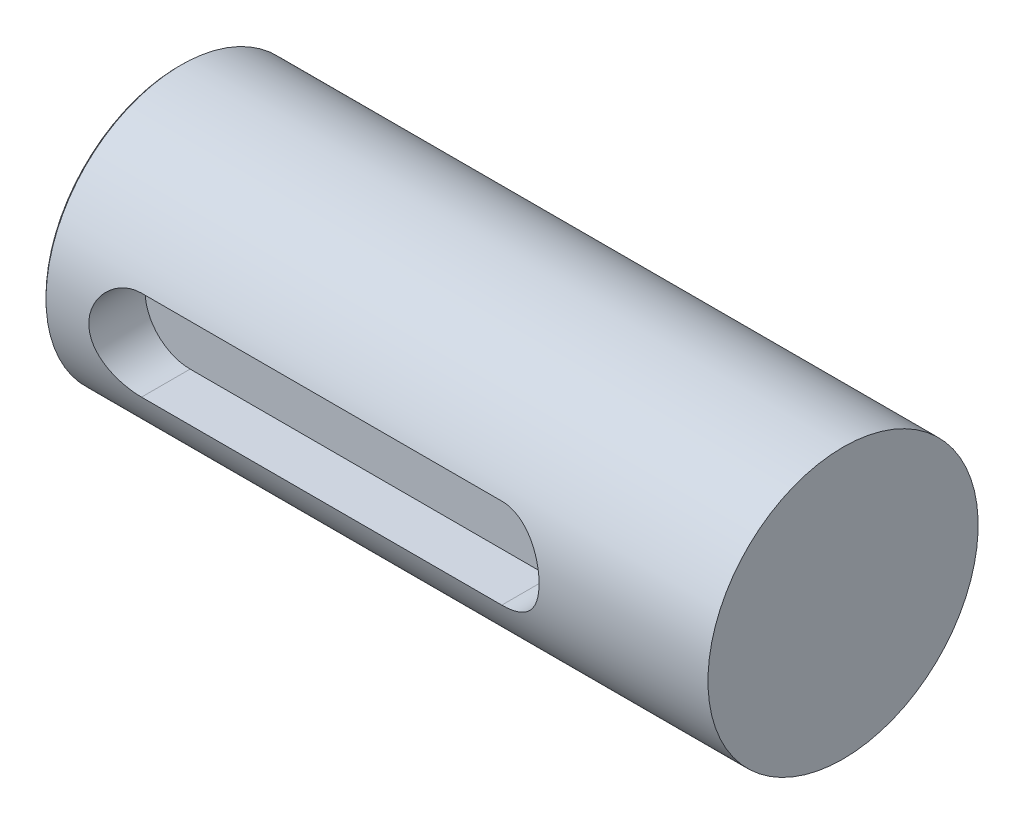
ISO-10303-21;
HEADER;
FILE_DESCRIPTION(('STEP AP214'),'2;1');
FILE_NAME('part.step','',(''),(''),'','','');
FILE_SCHEMA(('AUTOMOTIVE_DESIGN { 1 0 10303 214 1 1 1 1 }'));
ENDSEC;
DATA;
#1=APPLICATION_CONTEXT('core data for automotive mechanical design processes');
#2=APPLICATION_PROTOCOL_DEFINITION('international standard','automotive_design',2000,#1);
#3=PRODUCT_CONTEXT('',#1,'mechanical');
#4=PRODUCT('Part','Part','',(#3));
#5=PRODUCT_RELATED_PRODUCT_CATEGORY('part','',(#4));
#6=PRODUCT_DEFINITION_FORMATION('','',#4);
#7=PRODUCT_DEFINITION_CONTEXT('part definition',#1,'design');
#8=PRODUCT_DEFINITION('design','',#6,#7);
#9=PRODUCT_DEFINITION_SHAPE('','',#8);
#10=(LENGTH_UNIT() NAMED_UNIT(*) SI_UNIT(.MILLI.,.METRE.));
#11=(NAMED_UNIT(*) PLANE_ANGLE_UNIT() SI_UNIT($,.RADIAN.));
#12=(NAMED_UNIT(*) SI_UNIT($,.STERADIAN.) SOLID_ANGLE_UNIT());
#13=UNCERTAINTY_MEASURE_WITH_UNIT(LENGTH_MEASURE(1.E-05),#10,'distance_accuracy_value','');
#14=(GEOMETRIC_REPRESENTATION_CONTEXT(3) GLOBAL_UNCERTAINTY_ASSIGNED_CONTEXT((#13)) GLOBAL_UNIT_ASSIGNED_CONTEXT((#10,
#11,#12)) REPRESENTATION_CONTEXT('',''));
#15=CARTESIAN_POINT('',(0.,0.,0.));
#16=DIRECTION('',(0.,0.,1.));
#17=DIRECTION('',(1.,0.,0.));
#18=AXIS2_PLACEMENT_3D('',#15,#16,#17);
#19=CARTESIAN_POINT('',(-9.5,-2.,3.5));
#20=DIRECTION('',(0.,-1.,0.));
#21=DIRECTION('',(0.,0.,-1.));
#22=AXIS2_PLACEMENT_3D('',#19,#20,#21);
#23=PLANE('',#22);
#24=DIRECTION('',(-1.,0.,0.));
#25=VECTOR('',#24,1.);
#26=CARTESIAN_POINT('',(-9.5,-2.,5.656854249492));
#27=LINE('',#26,#25);
#28=CARTESIAN_POINT('',(-9.5,-2.,5.656854249492));
#29=VERTEX_POINT('',#28);
#30=CARTESIAN_POINT('',(-25.5,-2.,5.656854249492));
#31=VERTEX_POINT('',#30);
#32=EDGE_CURVE('E88',#29,#31,#27,.T.);
#33=ORIENTED_EDGE('',*,*,#32,.F.);
#34=DIRECTION('',(0.,0.,1.));
#35=VECTOR('',#34,1.);
#36=CARTESIAN_POINT('',(-9.5,-2.,3.5));
#37=LINE('',#36,#35);
#38=CARTESIAN_POINT('',(-9.5,-2.,3.5));
#39=VERTEX_POINT('',#38);
#40=EDGE_CURVE('E11',#39,#29,#37,.T.);
#41=ORIENTED_EDGE('',*,*,#40,.F.);
#42=DIRECTION('',(-1.,0.,0.));
#43=VECTOR('',#42,1.);
#44=CARTESIAN_POINT('',(-9.5,-2.,3.5));
#45=LINE('',#44,#43);
#46=CARTESIAN_POINT('',(-25.5,-2.,3.5));
#47=VERTEX_POINT('',#46);
#48=EDGE_CURVE('E86',#39,#47,#45,.T.);
#49=ORIENTED_EDGE('',*,*,#48,.T.);
#50=DIRECTION('',(0.,0.,-1.));
#51=VECTOR('',#50,1.);
#52=CARTESIAN_POINT('',(-25.5,-2.,5.656854249492));
#53=LINE('',#52,#51);
#54=EDGE_CURVE('E178',#31,#47,#53,.T.);
#55=ORIENTED_EDGE('',*,*,#54,.F.);
#56=EDGE_LOOP('',(#33,#41,#49,#55));
#57=FACE_BOUND('',#56,.T.);
#58=ADVANCED_FACE('F17',(#57),#23,.F.);
#59=CARTESIAN_POINT('',(-9.5,0.,3.5));
#60=DIRECTION('',(0.,0.,-1.));
#61=DIRECTION('',(0.,-1.,0.));
#62=AXIS2_PLACEMENT_3D('',#59,#60,#61);
#63=CYLINDRICAL_SURFACE('',#62,2.);
#64=CARTESIAN_POINT('',(-9.50000000000001,-2.,5.65685424949238));
#65=CARTESIAN_POINT('',(-9.46888727933629,-2.00000085053112,5.65685451528089));
#66=CARTESIAN_POINT('',(-9.43777507841208,-1.99927403942647,5.65712883653932));
#67=CARTESIAN_POINT('',(-9.37512510014198,-1.99634779946615,5.65820957137652));
#68=CARTESIAN_POINT('',(-9.34358856935879,-1.99412476525183,5.65902451108427));
#69=CARTESIAN_POINT('',(-9.28016475893564,-1.98814075978606,5.66118632629942));
#70=CARTESIAN_POINT('',(-9.24828006013282,-1.98435548684095,5.66254159512988));
#71=CARTESIAN_POINT('',(-9.18424071907965,-1.97518585038153,5.66578415810092));
#72=CARTESIAN_POINT('',(-9.15209005890953,-1.96977659951175,5.66767970727348));
#73=CARTESIAN_POINT('',(-9.08760628317206,-1.95730101960362,5.67200342892186));
#74=CARTESIAN_POINT('',(-9.05527862417273,-1.95020930914261,5.67443971854995));
#75=CARTESIAN_POINT('',(-8.9905343523952,-1.93431478105617,5.67984323146518));
#76=CARTESIAN_POINT('',(-8.95812472799632,-1.9254861892777,5.68281839067245));
#77=CARTESIAN_POINT('',(-8.89331797891303,-1.90606916610999,5.68930683701968));
#78=CARTESIAN_POINT('',(-8.86092945830196,-1.895454687067,5.6928280176363));
#79=CARTESIAN_POINT('',(-8.79626674788044,-1.87241981442431,5.70038173738445));
#80=CARTESIAN_POINT('',(-8.76400273497141,-1.85997317208112,5.70442157624716));
#81=CARTESIAN_POINT('',(-8.71124718360211,-1.83803701009443,5.71155662288523));
#82=CARTESIAN_POINT('',(-8.69053995019249,-1.8290117412629,5.71449590590778));
#83=CARTESIAN_POINT('',(-8.64683782799037,-1.80907782484876,5.72097295508211));
#84=CARTESIAN_POINT('',(-8.62388955078971,-1.79807599807631,5.72453916146741));
#85=CARTESIAN_POINT('',(-8.57587077801184,-1.77391860804623,5.73225954637954));
#86=CARTESIAN_POINT('',(-8.55085529582041,-1.76066035295548,5.73643450032803));
#87=CARTESIAN_POINT('',(-8.49890845554614,-1.73170086870074,5.74538230878574));
#88=CARTESIAN_POINT('',(-8.47204206663606,-1.71588840554907,5.75017270278051));
#89=CARTESIAN_POINT('',(-8.41664489064394,-1.68151730618327,5.76035289285807));
#90=CARTESIAN_POINT('',(-8.38819041410355,-1.66283996578184,5.76575711179524));
#91=CARTESIAN_POINT('',(-8.32991712750982,-1.62242639888414,5.77716849936532));
#92=CARTESIAN_POINT('',(-8.30018718608102,-1.60056508668202,5.78318794099448));
#93=CARTESIAN_POINT('',(-8.25569526455089,-1.56591407728681,5.79249115313858));
#94=CARTESIAN_POINT('',(-8.24047389776431,-1.55369714508387,5.79572914560888));
#95=CARTESIAN_POINT('',(-8.20984355291471,-1.52836700301695,5.80235845685956));
#96=CARTESIAN_POINT('',(-8.19444840581248,-1.51523735537635,5.80575102191057));
#97=CARTESIAN_POINT('',(-8.16352623190116,-1.48804460003855,5.8126866695158));
#98=CARTESIAN_POINT('',(-8.14801403807037,-1.47396490118124,5.81623080931448));
#99=CARTESIAN_POINT('',(-8.116918489029,-1.44483732593382,5.82348050561488));
#100=CARTESIAN_POINT('',(-8.10135103680599,-1.42977280558663,5.82718742131878));
#101=CARTESIAN_POINT('',(-8.07135165836881,-1.39978383228863,5.834442793743));
#102=CARTESIAN_POINT('',(-8.05689944783943,-1.38487971369161,5.83799141503488));
#103=CARTESIAN_POINT('',(-8.02887215693227,-1.35506065416135,5.84493928035651));
#104=CARTESIAN_POINT('',(-8.01528379781296,-1.34015848056933,5.84833987712926));
#105=CARTESIAN_POINT('',(-7.97639139716592,-1.29618725802304,5.85818198770486));
#106=CARTESIAN_POINT('',(-7.95168530905919,-1.26657351609882,5.86457308013364));
#107=CARTESIAN_POINT('',(-7.90549582167997,-1.2078345528071,5.87678496860692));
#108=CARTESIAN_POINT('',(-7.88390754285016,-1.17879378162781,5.8826164922799));
#109=CARTESIAN_POINT('',(-7.84370230161328,-1.12152542506829,5.89371020993367));
#110=CARTESIAN_POINT('',(-7.82498322562179,-1.09337188467561,5.898984496389));
#111=CARTESIAN_POINT('',(-7.79026058404441,-1.03816073382961,5.90896193020306));
#112=CARTESIAN_POINT('',(-7.7741585747307,-1.01116751389257,5.9136790235979));
#113=CARTESIAN_POINT('',(-7.74441268941123,-0.958517674343109,5.92253872497926));
#114=CARTESIAN_POINT('',(-7.73067499919649,-0.932916778459278,5.9266976753536));
#115=CARTESIAN_POINT('',(-7.7054051002741,-0.883255220259345,5.93444333430294));
#116=CARTESIAN_POINT('',(-7.6937844601492,-0.859242505069705,5.93804891300444));
#117=CARTESIAN_POINT('',(-7.67250416562077,-0.81292597722427,5.94466873953945));
#118=CARTESIAN_POINT('',(-7.66276217409243,-0.790663347182874,5.94770699124825));
#119=CARTESIAN_POINT('',(-7.6402558603313,-0.736564047819112,5.95472056880531));
#120=CARTESIAN_POINT('',(-7.62788987278882,-0.704544128397295,5.95856940828527));
#121=CARTESIAN_POINT('',(-7.60496476322377,-0.640303824365149,5.96576195063087));
#122=CARTESIAN_POINT('',(-7.59438342639195,-0.608092036597834,5.96911179204235));
#123=CARTESIAN_POINT('',(-7.57499297095129,-0.543568950411801,5.97528670891373));
#124=CARTESIAN_POINT('',(-7.5661617867683,-0.511264911108535,5.97811827838711));
#125=CARTESIAN_POINT('',(-7.55023361114859,-0.446657580022857,5.98326168643518));
#126=CARTESIAN_POINT('',(-7.54311477182371,-0.414360192261541,5.98558003888741));
#127=CARTESIAN_POINT('',(-7.53056790435671,-0.349859980587352,5.98969557699173));
#128=CARTESIAN_POINT('',(-7.52511834321299,-0.317661768575115,5.99149937724037));
#129=CARTESIAN_POINT('',(-7.51586244619266,-0.253448626514268,5.9945860912599));
#130=CARTESIAN_POINT('',(-7.51203497582357,-0.221437064712799,5.99587569062349));
#131=CARTESIAN_POINT('',(-7.50597178582032,-0.157680379646253,5.99793380522427));
#132=CARTESIAN_POINT('',(-7.50371541103877,-0.125937439246107,5.99870907565855));
#133=CARTESIAN_POINT('',(-7.50073956858502,-0.0627956272051468,5.99973860288367));
#134=CARTESIAN_POINT('',(-7.5000000000249,-0.0313978145488789,5.99999967206047));
#135=CARTESIAN_POINT('',(-7.49999999997511,0.0313867179558821,6.00000032782363));
#136=CARTESIAN_POINT('',(-7.50073904582225,0.0627734378030378,5.99974009867938));
#137=CARTESIAN_POINT('',(-7.50371294285013,0.125896305648526,5.99871192770988));
#138=CARTESIAN_POINT('',(-7.50596803867377,0.15763138744358,5.99793711610224));
#139=CARTESIAN_POINT('',(-7.51202821032846,0.221375626638298,5.99587981028665));
#140=CARTESIAN_POINT('',(-7.51585408866163,0.25338258610222,5.99459050918191));
#141=CARTESIAN_POINT('',(-7.52510679211923,0.317589784966003,5.99150422137524));
#142=CARTESIAN_POINT('',(-7.53055490217465,0.349786632833632,5.98970049925679));
#143=CARTESIAN_POINT('',(-7.54309931645068,0.414287321599386,5.98558495762252));
#144=CARTESIAN_POINT('',(-7.55021730663946,0.446586518684334,5.98326647646459));
#145=CARTESIAN_POINT('',(-7.56614469588914,0.511200572373977,5.97812265627391));
#146=CARTESIAN_POINT('',(-7.57497609777155,0.543509484098572,5.97529075911896));
#147=CARTESIAN_POINT('',(-7.59436835957773,0.608045260905717,5.96911498402261));
#148=CARTESIAN_POINT('',(-7.60495144126354,0.64026481649987,5.96576456922197));
#149=CARTESIAN_POINT('',(-7.62788187692817,0.704523421028356,5.95857085543372));
#150=CARTESIAN_POINT('',(-7.64025160283777,0.736553813680613,5.95472138170528));
#151=CARTESIAN_POINT('',(-7.66275904807527,0.790655833221561,5.94770832960034));
#152=CARTESIAN_POINT('',(-7.67249764409811,0.812911073140184,5.94467149487934));
#153=CARTESIAN_POINT('',(-7.69377155529658,0.859215197342403,5.93805406920433));
#154=CARTESIAN_POINT('',(-7.70538926386938,0.883222867850188,5.93444942511728));
#155=CARTESIAN_POINT('',(-7.73065390785233,0.932876667875198,5.92670530572481));
#156=CARTESIAN_POINT('',(-7.74438934603163,0.958474812445656,5.92254693539056));
#157=CARTESIAN_POINT('',(-7.77413156897829,1.01112138363806,5.91368801939506));
#158=CARTESIAN_POINT('',(-7.79023225263415,1.03811403841779,5.90897110960662));
#159=CARTESIAN_POINT('',(-7.82495335446319,1.0933261574434,5.89899367381202));
#160=CARTESIAN_POINT('',(-7.843672313354,1.1214811713047,5.8937191862001));
#161=CARTESIAN_POINT('',(-7.88387872778823,1.17875438307197,5.88262468925042));
#162=CARTESIAN_POINT('',(-7.90546840455142,1.20779846210634,5.87679257526612));
#163=CARTESIAN_POINT('',(-7.95166240968938,1.26654569923666,5.86457912709221));
#164=CARTESIAN_POINT('',(-7.9763717342401,1.29616431741935,5.85818705577256));
#165=CARTESIAN_POINT('',(-8.01526994898559,1.34014319465651,5.84834333706748));
#166=CARTESIAN_POINT('',(-8.02886071359695,1.355048286765,5.84494210653098));
#167=CARTESIAN_POINT('',(-8.05689338023882,1.38487345628587,5.83799287638615));
#168=CARTESIAN_POINT('',(-8.07134857665883,1.39978075162668,5.8344435229962));
#169=CARTESIAN_POINT('',(-8.10134818759544,1.42976995738607,5.82718812715514));
#170=CARTESIAN_POINT('',(-8.11691269817087,1.44483172216933,5.82348192197867));
#171=CARTESIAN_POINT('',(-8.14800258282861,1.47395434423658,5.81623354869979));
#172=CARTESIAN_POINT('',(-8.16351206844641,1.4880318299803,5.81269002233481));
#173=CARTESIAN_POINT('',(-8.19442909514351,1.51522067736199,5.80575550720657));
#174=CARTESIAN_POINT('',(-8.20982181641766,1.52834861499134,5.80236346190282));
#175=CARTESIAN_POINT('',(-8.24044762392891,1.55367581510643,5.79573509464524));
#176=CARTESIAN_POINT('',(-8.25566689110982,1.56589150064273,5.79249752732792));
#177=CARTESIAN_POINT('',(-8.30015369394954,1.60053990565142,5.78319531371683));
#178=CARTESIAN_POINT('',(-8.32988056051562,1.62239995306856,5.77717644333898));
#179=CARTESIAN_POINT('',(-8.38814933882755,1.66281247929914,5.76576581059089));
#180=CARTESIAN_POINT('',(-8.41660245069954,1.68148994075823,5.76036178588874));
#181=CARTESIAN_POINT('',(-8.47199874065656,1.71586246853126,5.75018159776153));
#182=CARTESIAN_POINT('',(-8.49886566252346,1.73167614869366,5.7453910253943));
#183=CARTESIAN_POINT('',(-8.55081555537277,1.76063898080412,5.73644245652011));
#184=CARTESIAN_POINT('',(-8.57583359940831,1.7738992907026,5.73226694104206));
#185=CARTESIAN_POINT('',(-8.62385958426981,1.79806147260785,5.72454506393533));
#186=CARTESIAN_POINT('',(-8.64681254352134,1.80906597581908,5.72097795085838));
#187=CARTESIAN_POINT('',(-8.69052616322058,1.82900573249843,5.71449858298957));
#188=CARTESIAN_POINT('',(-8.71124023774717,1.83803412190356,5.71155794018749));
#189=CARTESIAN_POINT('',(-8.76399799936259,1.85997120305697,5.70442163959737));
#190=CARTESIAN_POINT('',(-8.79625715793218,1.87241611571541,5.70038170073228));
#191=CARTESIAN_POINT('',(-8.86091139276961,1.89544852953731,5.69282790379872));
#192=CARTESIAN_POINT('',(-8.89329631930265,1.90606220639132,5.68930675978111));
#193=CARTESIAN_POINT('',(-8.95809719567255,1.9254784025381,5.68281833322015));
#194=CARTESIAN_POINT('',(-8.99050456459729,1.93430689715714,5.67984317609418));
#195=CARTESIAN_POINT('',(-9.05524572573322,1.95020179418044,5.67443965790804));
#196=CARTESIAN_POINT('',(-9.08757254825108,1.95729389916197,5.6720033802027));
#197=CARTESIAN_POINT('',(-9.15205610551427,1.96977061432443,5.66767965986039));
#198=CARTESIAN_POINT('',(-9.18420739827419,1.97518053546437,5.66578412105485));
#199=CARTESIAN_POINT('',(-9.24824949259154,1.98435164459963,5.66254155762758));
#200=CARTESIAN_POINT('',(-9.28013632269909,1.98813765084961,5.66118630040332));
#201=CARTESIAN_POINT('',(-9.34356589550313,1.99412304475648,5.6590244856229));
#202=CARTESIAN_POINT('',(-9.3751060642627,1.99634666660811,5.65820955874436));
#203=CARTESIAN_POINT('',(-9.43776481132398,1.99927379985539,5.65712882268527));
#204=CARTESIAN_POINT('',(-9.46888214639222,2.00000085099539,5.65685451305038));
#205=CARTESIAN_POINT('',(-9.5,2.,5.65685424949238));
#206=B_SPLINE_CURVE_WITH_KNOTS('',3,(#64,#65,#66,#67,#68,#69,#70,#71,#72,#73,#74,#75,#76,#77,
#78,#79,#80,#81,#82,#83,#84,#85,#86,#87,#88,#89,#90,#91,#92,#93,#94,#95,#96,#97,#98,#99,#100,
#101,#102,#103,#104,#105,#106,#107,#108,#109,#110,#111,#112,#113,#114,#115,#116,#117,#118,#119,
#120,#121,#122,#123,#124,#125,#126,#127,#128,#129,#130,#131,#132,#133,#134,#135,#136,#137,#138,
#139,#140,#141,#142,#143,#144,#145,#146,#147,#148,#149,#150,#151,#152,#153,#154,#155,#156,#157,
#158,#159,#160,#161,#162,#163,#164,#165,#166,#167,#168,#169,#170,#171,#172,#173,#174,#175,#176,
#177,#178,#179,#180,#181,#182,#183,#184,#185,#186,#187,#188,#189,#190,#191,#192,#193,#194,#195,
#196,#197,#198,#199,#200,#201,#202,#203,#204,#205),.UNSPECIFIED.,.F.,.F.,(4,2,2,2,2,2,2,2,2,2,2,
2,2,2,2,2,2,2,2,2,2,2,2,2,2,2,2,2,2,2,2,2,2,2,2,2,2,2,2,2,2,2,2,2,2,2,2,2,2,2,2,2,2,2,2,2,2,2,2,
2,2,2,2,2,2,2,2,2,2,2,4),(0.,0.0933277823788511,0.188163590974819,0.28453383298338,
0.382463673516788,0.48197709372188,0.583096947296585,0.685845015223881,0.790242058590605,
0.858566632863993,0.935640473547705,1.0214686756905,1.11605478504053,1.21940130961992,
1.33151003178524,1.39085682774532,1.45239531141046,1.51612563073043,1.58204791658554,
1.64522244690292,1.70657076210168,1.82377762829341,1.93368450242727,2.03629352667484,
2.13160743483162,2.2196297409121,2.30036501263834,2.37381928007017,2.47738774851301,
2.57955270884863,2.68033369317349,2.77975104979342,2.87782597627801,2.97458055301948,
3.07003777714843,3.16422159663157,3.25837212973708,3.35380555905963,3.45054585146588,
3.54861601520678,3.64803813477441,3.74883340552734,3.85102216790987,3.95462394111869,
4.0280534916618,4.10877110271194,4.19678281035236,4.29209318533128,4.39470574290769,
4.50462321703462,4.62184774936324,4.68320755096425,4.74639533468996,4.81230535097423,
4.87602503666505,4.93755452267257,4.99689395696474,5.10899286650148,5.21233612022696,
5.3069255002789,5.39276351349813,5.46985370279243,5.5382011573536,5.64258290949087,
5.74532003814821,5.84643331900533,5.94594454563452,6.04387658198748,6.1402534167618,
6.23510021951211,6.32844339832265),.UNSPECIFIED.);
#207=CARTESIAN_POINT('',(-9.5,2.,5.656854249492));
#208=VERTEX_POINT('',#207);
#209=EDGE_CURVE('E131',#29,#208,#206,.T.);
#210=ORIENTED_EDGE('',*,*,#209,.T.);
#211=DIRECTION('',(0.,0.,-1.));
#212=VECTOR('',#211,1.);
#213=CARTESIAN_POINT('',(-9.5,2.,5.656854249492));
#214=LINE('',#213,#212);
#215=CARTESIAN_POINT('',(-9.5,2.,3.5));
#216=VERTEX_POINT('',#215);
#217=EDGE_CURVE('E29',#208,#216,#214,.T.);
#218=ORIENTED_EDGE('',*,*,#217,.T.);
#219=CARTESIAN_POINT('',(-9.5,0.,3.5));
#220=DIRECTION('',(0.,0.,1.));
#221=DIRECTION('',(0.,-1.,0.));
#222=AXIS2_PLACEMENT_3D('',#219,#220,#221);
#223=CIRCLE('',#222,2.);
#224=EDGE_CURVE('E93',#39,#216,#223,.T.);
#225=ORIENTED_EDGE('',*,*,#224,.F.);
#226=ORIENTED_EDGE('',*,*,#40,.T.);
#227=EDGE_LOOP('',(#210,#218,#225,#226));
#228=FACE_BOUND('',#227,.T.);
#229=ADVANCED_FACE('F19',(#228),#63,.F.);
#230=CARTESIAN_POINT('',(-25.5,2.,3.5));
#231=DIRECTION('',(0.,1.,0.));
#232=DIRECTION('',(1.,0.,0.));
#233=AXIS2_PLACEMENT_3D('',#230,#231,#232);
#234=PLANE('',#233);
#235=DIRECTION('',(1.,0.,0.));
#236=VECTOR('',#235,1.);
#237=CARTESIAN_POINT('',(-25.5,2.,5.656854249492));
#238=LINE('',#237,#236);
#239=CARTESIAN_POINT('',(-25.5,2.,5.656854249492));
#240=VERTEX_POINT('',#239);
#241=EDGE_CURVE('E218',#240,#208,#238,.T.);
#242=ORIENTED_EDGE('',*,*,#241,.F.);
#243=DIRECTION('',(0.,0.,1.));
#244=VECTOR('',#243,1.);
#245=CARTESIAN_POINT('',(-25.5,2.,3.5));
#246=LINE('',#245,#244);
#247=CARTESIAN_POINT('',(-25.5,2.,3.5));
#248=VERTEX_POINT('',#247);
#249=EDGE_CURVE('E118',#248,#240,#246,.T.);
#250=ORIENTED_EDGE('',*,*,#249,.F.);
#251=DIRECTION('',(1.,0.,0.));
#252=VECTOR('',#251,1.);
#253=CARTESIAN_POINT('',(-25.5,2.,3.5));
#254=LINE('',#253,#252);
#255=EDGE_CURVE('E98',#248,#216,#254,.T.);
#256=ORIENTED_EDGE('',*,*,#255,.T.);
#257=ORIENTED_EDGE('',*,*,#217,.F.);
#258=EDGE_LOOP('',(#242,#250,#256,#257));
#259=FACE_BOUND('',#258,.T.);
#260=ADVANCED_FACE('F159',(#259),#234,.F.);
#261=CARTESIAN_POINT('',(0.,3.,0.));
#262=DIRECTION('',(1.,0.,0.));
#263=DIRECTION('',(0.,1.,0.));
#264=AXIS2_PLACEMENT_3D('',#261,#262,#263);
#265=PLANE('',#264);
#266=CARTESIAN_POINT('',(0.,0.,0.));
#267=DIRECTION('',(1.,0.,0.));
#268=DIRECTION('',(0.,-1.,0.));
#269=AXIS2_PLACEMENT_3D('',#266,#267,#268);
#270=CIRCLE('',#269,6.);
#271=CARTESIAN_POINT('',(0.,-6.,0.));
#272=VERTEX_POINT('',#271);
#273=EDGE_CURVE('E112',#272,#272,#270,.T.);
#274=ORIENTED_EDGE('',*,*,#273,.T.);
#275=EDGE_LOOP('',(#274));
#276=FACE_BOUND('',#275,.T.);
#277=ADVANCED_FACE('F211',(#276),#265,.T.);
#278=CARTESIAN_POINT('',(-29.5,3.,0.));
#279=DIRECTION('',(-1.,0.,0.));
#280=DIRECTION('',(0.,0.,1.));
#281=AXIS2_PLACEMENT_3D('',#278,#279,#280);
#282=PLANE('',#281);
#283=CARTESIAN_POINT('',(-29.5,0.,0.));
#284=DIRECTION('',(-1.,0.,0.));
#285=DIRECTION('',(0.,0.,-1.));
#286=AXIS2_PLACEMENT_3D('',#283,#284,#285);
#287=CIRCLE('',#286,5.9);
#288=CARTESIAN_POINT('',(-29.5,0.,-5.9));
#289=VERTEX_POINT('',#288);
#290=EDGE_CURVE('E40',#289,#289,#287,.T.);
#291=ORIENTED_EDGE('',*,*,#290,.T.);
#292=EDGE_LOOP('',(#291));
#293=FACE_BOUND('',#292,.T.);
#294=ADVANCED_FACE('F216',(#293),#282,.T.);
#295=CARTESIAN_POINT('',(-29.45,0.,0.));
#296=DIRECTION('',(1.,0.,0.));
#297=DIRECTION('',(0.,0.,1.));
#298=AXIS2_PLACEMENT_3D('',#295,#296,#297);
#299=CONICAL_SURFACE('',#298,5.95,0.785398163397448);
#300=CARTESIAN_POINT('',(-29.4,0.,0.));
#301=DIRECTION('',(-1.,0.,0.));
#302=DIRECTION('',(0.,0.,-1.));
#303=AXIS2_PLACEMENT_3D('',#300,#301,#302);
#304=CIRCLE('',#303,6.);
#305=CARTESIAN_POINT('',(-29.4,0.,-6.));
#306=VERTEX_POINT('',#305);
#307=CARTESIAN_POINT('',(-29.4,-6.,0.));
#308=VERTEX_POINT('',#307);
#309=EDGE_CURVE('E114',#306,#308,#304,.T.);
#310=ORIENTED_EDGE('',*,*,#309,.T.);
#311=CARTESIAN_POINT('',(-29.4,0.,0.));
#312=DIRECTION('',(-1.,0.,0.));
#313=DIRECTION('',(0.,0.,-1.));
#314=AXIS2_PLACEMENT_3D('',#311,#312,#313);
#315=CIRCLE('',#314,6.);
#316=EDGE_CURVE('E117',#308,#306,#315,.T.);
#317=ORIENTED_EDGE('',*,*,#316,.T.);
#318=DIRECTION('',(-0.707106781186548,0.,0.707106781186548));
#319=VECTOR('',#318,1.);
#320=CARTESIAN_POINT('',(-29.45,0.,-5.95));
#321=LINE('',#320,#319);
#322=EDGE_CURVE('E126',#306,#289,#321,.T.);
#323=ORIENTED_EDGE('',*,*,#322,.T.);
#324=ORIENTED_EDGE('',*,*,#290,.F.);
#325=ORIENTED_EDGE('',*,*,#322,.F.);
#326=EDGE_LOOP('',(#310,#317,#323,#324,#325));
#327=FACE_BOUND('',#326,.T.);
#328=ADVANCED_FACE('F158',(#327),#299,.T.);
#329=CARTESIAN_POINT('',(-14.75,0.,0.));
#330=DIRECTION('',(-1.,0.,0.));
#331=DIRECTION('',(0.,1.,0.));
#332=AXIS2_PLACEMENT_3D('',#329,#330,#331);
#333=CYLINDRICAL_SURFACE('',#332,6.);
#334=ORIENTED_EDGE('',*,*,#241,.T.);
#335=ORIENTED_EDGE('',*,*,#209,.F.);
#336=ORIENTED_EDGE('',*,*,#32,.T.);
#337=CARTESIAN_POINT('',(-25.5,2.,5.65685424949238));
#338=CARTESIAN_POINT('',(-25.5311127206609,2.00000085053112,5.6568545152809));
#339=CARTESIAN_POINT('',(-25.5622249215824,1.9992740394266,5.65712883653933));
#340=CARTESIAN_POINT('',(-25.6248748998478,1.99634779946676,5.65820957137653));
#341=CARTESIAN_POINT('',(-25.656411430629,1.99412476525275,5.65902451108429));
#342=CARTESIAN_POINT('',(-25.7198352410491,1.98814075978774,5.66118632629943));
#343=CARTESIAN_POINT('',(-25.7517199398507,1.98435548684302,5.6625415951299));
#344=CARTESIAN_POINT('',(-25.8157592809024,1.97518585038439,5.66578415810094));
#345=CARTESIAN_POINT('',(-25.8479099410722,1.96977659951497,5.6676797072735));
#346=CARTESIAN_POINT('',(-25.9123937168098,1.95730101960745,5.67200342892188));
#347=CARTESIAN_POINT('',(-25.9447213758096,1.95020930914665,5.67443971854998));
#348=CARTESIAN_POINT('',(-26.0094656475888,1.93431478106042,5.67984323146521));
#349=CARTESIAN_POINT('',(-26.0418752719889,1.92548618928189,5.68281839067248));
#350=CARTESIAN_POINT('',(-26.1066820210753,1.90606916611373,5.68930683701972));
#351=CARTESIAN_POINT('',(-26.1390705416883,1.89545468707031,5.69282801763636));
#352=CARTESIAN_POINT('',(-26.2037332521144,1.8724198144263,5.70038173738447));
#353=CARTESIAN_POINT('',(-26.235997265026,1.85997317208219,5.70442157624714));
#354=CARTESIAN_POINT('',(-26.288752816397,1.83803701009481,5.71155662288489));
#355=CARTESIAN_POINT('',(-26.3094600498057,1.82901174126367,5.7144959059071));
#356=CARTESIAN_POINT('',(-26.3531621720064,1.80907782485027,5.72097295508085));
#357=CARTESIAN_POINT('',(-26.3761104492065,1.79807599807816,5.72453916146592));
#358=CARTESIAN_POINT('',(-26.4241292219834,1.77391860804869,5.73225954637769));
#359=CARTESIAN_POINT('',(-26.4491447041745,1.7606603529582,5.73643450032604));
#360=CARTESIAN_POINT('',(-26.5010915444484,1.73170086870389,5.74538230878357));
#361=CARTESIAN_POINT('',(-26.5279579333584,1.71588840555237,5.75017270277829));
#362=CARTESIAN_POINT('',(-26.5833551093507,1.68151730618676,5.76035289285585));
#363=CARTESIAN_POINT('',(-26.6118095858912,1.66283996578534,5.76575711179308));
#364=CARTESIAN_POINT('',(-26.6700828724855,1.6224263988875,5.77716849936334));
#365=CARTESIAN_POINT('',(-26.6998128139147,1.60056508668522,5.78318794099264));
#366=CARTESIAN_POINT('',(-26.7443047354455,1.56591407728968,5.792491153137));
#367=CARTESIAN_POINT('',(-26.7595261022323,1.55369714508659,5.79572914560741));
#368=CARTESIAN_POINT('',(-26.7901564470825,1.52836700301929,5.80235845685831));
#369=CARTESIAN_POINT('',(-26.8055515941851,1.51523735537847,5.80575102190946));
#370=CARTESIAN_POINT('',(-26.836473768097,1.48804460004017,5.81268666951497));
#371=CARTESIAN_POINT('',(-26.8519859619282,1.47396490118258,5.8162308093138));
#372=CARTESIAN_POINT('',(-26.8830815109703,1.44483732593453,5.82348050561452));
#373=CARTESIAN_POINT('',(-26.8986489631936,1.42977280558699,5.82718742131861));
#374=CARTESIAN_POINT('',(-26.9286483416307,1.39978383228915,5.83444279374296));
#375=CARTESIAN_POINT('',(-26.9431005521595,1.38487971369267,5.8379914150348));
#376=CARTESIAN_POINT('',(-26.9711278430658,1.35506065416345,5.84493928035635));
#377=CARTESIAN_POINT('',(-26.9847162021847,1.34015848057192,5.84833987712905));
#378=CARTESIAN_POINT('',(-27.0236086028307,1.29618725802693,5.85818198770457));
#379=CARTESIAN_POINT('',(-27.0483146909369,1.26657351610354,5.86457308013329));
#380=CARTESIAN_POINT('',(-27.0945041783154,1.20783455281322,5.87678496860648));
#381=CARTESIAN_POINT('',(-27.1160924571449,1.17879378163449,5.88261649227943));
#382=CARTESIAN_POINT('',(-27.1562976983816,1.1215254250758,5.89371020993315));
#383=CARTESIAN_POINT('',(-27.1750167743731,1.09337188468337,5.89898449638847));
#384=CARTESIAN_POINT('',(-27.2097394159508,1.03816073383754,5.90896193020253));
#385=CARTESIAN_POINT('',(-27.2258414252647,1.01116751390039,5.91367902359739));
#386=CARTESIAN_POINT('',(-27.2555873105848,0.958517674350382,5.92253872497879));
#387=CARTESIAN_POINT('',(-27.2693250007999,0.932916778466084,5.92669767535316));
#388=CARTESIAN_POINT('',(-27.2945948997232,0.883255220264835,5.9344433343026));
#389=CARTESIAN_POINT('',(-27.3062155398486,0.859242505074342,5.93804891300415));
#390=CARTESIAN_POINT('',(-27.3274958343781,0.812925977226801,5.9446687395393));
#391=CARTESIAN_POINT('',(-27.337237825907,0.790663347184148,5.94770699124817));
#392=CARTESIAN_POINT('',(-27.3597441396701,0.736564047815648,5.95472056880563));
#393=CARTESIAN_POINT('',(-27.3721101272139,0.704544128390291,5.9585694082859));
#394=CARTESIAN_POINT('',(-27.3950352367807,0.640303824351957,5.96576195063205));
#395=CARTESIAN_POINT('',(-27.4056165736131,0.608092036582013,5.96911179204378));
#396=CARTESIAN_POINT('',(-27.4250070290544,0.543568950391687,5.97528670891552));
#397=CARTESIAN_POINT('',(-27.4338382132375,0.511264911086774,5.97811827838905));
#398=CARTESIAN_POINT('',(-27.4497663888569,0.446657579998822,5.9832616864373));
#399=CARTESIAN_POINT('',(-27.4568852281815,0.414360192236893,5.98558003888959));
#400=CARTESIAN_POINT('',(-27.4694320956477,0.349859980562542,5.98969557699391));
#401=CARTESIAN_POINT('',(-27.4748816567909,0.317661768550767,5.99149937724252));
#402=CARTESIAN_POINT('',(-27.4841375538102,0.25344862649193,5.99458609126186));
#403=CARTESIAN_POINT('',(-27.4879650241787,0.221437064692017,5.99587569062531));
#404=CARTESIAN_POINT('',(-27.4940282141809,0.157680379629681,5.99793380522574));
#405=CARTESIAN_POINT('',(-27.4962845889621,0.125937439232194,5.99870907565979));
#406=CARTESIAN_POINT('',(-27.4992604314152,0.0627956271976417,5.99973860288435));
#407=CARTESIAN_POINT('',(-27.4999999999751,0.0313978145451249,5.99999967206081));
#408=CARTESIAN_POINT('',(-27.5000000000249,-0.0313867179536263,6.00000032782329));
#409=CARTESIAN_POINT('',(-27.4992609541779,-0.0627734377985232,5.99974009867869));
#410=CARTESIAN_POINT('',(-27.4962870571504,-0.125896305640153,5.99871192770862));
#411=CARTESIAN_POINT('',(-27.494031961327,-0.157631387433605,5.99793711610075));
#412=CARTESIAN_POINT('',(-27.4879717896729,-0.221375626625786,5.99587981028479));
#413=CARTESIAN_POINT('',(-27.4841459113401,-0.25338258608877,5.99459050917991));
#414=CARTESIAN_POINT('',(-27.4748932078831,-0.317589784951341,5.99150422137306));
#415=CARTESIAN_POINT('',(-27.469445097828,-0.349786632818692,5.98970049925456));
#416=CARTESIAN_POINT('',(-27.4569006835525,-0.414287321584542,5.98558495762028));
#417=CARTESIAN_POINT('',(-27.4497826933639,-0.446586518669858,5.9832664764624));
#418=CARTESIAN_POINT('',(-27.4338553041143,-0.511200572360869,5.97812265627191));
#419=CARTESIAN_POINT('',(-27.4250239022319,-0.543509484086455,5.97529075911709));
#420=CARTESIAN_POINT('',(-27.4056316404253,-0.608045260896183,5.9691149840211));
#421=CARTESIAN_POINT('',(-27.3950485587392,-0.640264816491917,5.96576456922068));
#422=CARTESIAN_POINT('',(-27.3721181230735,-0.704523421024131,5.95857085543302));
#423=CARTESIAN_POINT('',(-27.3597483971631,-0.736553813678524,5.95472138170496));
#424=CARTESIAN_POINT('',(-27.3372409519252,-0.790655833220524,5.9477083296009));
#425=CARTESIAN_POINT('',(-27.3275023559028,-0.812911073138128,5.94467149488046));
#426=CARTESIAN_POINT('',(-27.3062284447052,-0.859215197338636,5.93805406920639));
#427=CARTESIAN_POINT('',(-27.2946107361328,-0.883222867845723,5.9344494251197));
#428=CARTESIAN_POINT('',(-27.2693460921506,-0.932876667869661,5.92670530572782));
#429=CARTESIAN_POINT('',(-27.2556106539716,-0.958474812439739,5.9225469353938));
#430=CARTESIAN_POINT('',(-27.2258684310254,-1.01112138363169,5.9136880193986));
#431=CARTESIAN_POINT('',(-27.2097677473698,-1.03811403841134,5.90897110961023));
#432=CARTESIAN_POINT('',(-27.1750466455409,-1.09332615743708,5.89899367381563));
#433=CARTESIAN_POINT('',(-27.1563276866501,-1.12148117129859,5.89371918620363));
#434=CARTESIAN_POINT('',(-27.1161212722157,-1.17875438306653,5.88262468925365));
#435=CARTESIAN_POINT('',(-27.0945315954524,-1.20779846210136,5.87679257526911));
#436=CARTESIAN_POINT('',(-27.0483375903138,-1.26654569923282,5.86457912709459));
#437=CARTESIAN_POINT('',(-27.0236282657626,-1.29616431741618,5.85818705577457));
#438=CARTESIAN_POINT('',(-26.9847300510163,-1.34014319465439,5.84834333706883));
#439=CARTESIAN_POINT('',(-26.9711392864046,-1.35504828676328,5.84494210653209));
#440=CARTESIAN_POINT('',(-26.943106619762,-1.384873456285,5.83799287638673));
#441=CARTESIAN_POINT('',(-26.9286514233416,-1.39978075162624,5.83444352299648));
#442=CARTESIAN_POINT('',(-26.8986518124066,-1.42976995738406,5.82718812715543));
#443=CARTESIAN_POINT('',(-26.8830873018332,-1.44483172216538,5.82348192197925));
#444=CARTESIAN_POINT('',(-26.8519974171794,-1.47395434422917,5.81623354870092));
#445=CARTESIAN_POINT('',(-26.8364879315635,-1.48803182997134,5.8126900223362));
#446=CARTESIAN_POINT('',(-26.80557090487,-1.51522067735028,5.80575550720843));
#447=CARTESIAN_POINT('',(-26.7901781835976,-1.52834861497844,5.8023634619049));
#448=CARTESIAN_POINT('',(-26.7595523760895,-1.55367581509147,5.79573509464771));
#449=CARTESIAN_POINT('',(-26.7443331089101,-1.5658915006269,5.79249752733057));
#450=CARTESIAN_POINT('',(-26.699846306074,-1.60053990563375,5.78319531371986));
#451=CARTESIAN_POINT('',(-26.67011943951,-1.62239995305001,5.77717644334224));
#452=CARTESIAN_POINT('',(-26.6118506612013,-1.66281247927986,5.76576581059448));
#453=CARTESIAN_POINT('',(-26.5833975493302,-1.68148994073904,5.7603617858924));
#454=CARTESIAN_POINT('',(-26.5280012593738,-1.71586246851308,5.7501815977652));
#455=CARTESIAN_POINT('',(-26.5011343375065,-1.73167614867633,5.74539102539788));
#456=CARTESIAN_POINT('',(-26.4491844446551,-1.76063898078914,5.73644245652338));
#457=CARTESIAN_POINT('',(-26.4241664006178,-1.77389929068906,5.73226694104509));
#458=CARTESIAN_POINT('',(-26.3761404157512,-1.79806147259766,5.72454506393774));
#459=CARTESIAN_POINT('',(-26.3531874564964,-1.80906597581077,5.72097795086041));
#460=CARTESIAN_POINT('',(-26.3094738367891,-1.82900573249421,5.71449858299064));
#461=CARTESIAN_POINT('',(-26.2887597622577,-1.83803412190154,5.71155794018801));
#462=CARTESIAN_POINT('',(-26.2360020006361,-1.85997120305751,5.70442163959741));
#463=CARTESIAN_POINT('',(-26.2037428420652,-1.87241611571641,5.7003817007323));
#464=CARTESIAN_POINT('',(-26.1390886072255,-1.89544852953897,5.69282790379874));
#465=CARTESIAN_POINT('',(-26.1067036806915,-1.90606220639319,5.68930675978113));
#466=CARTESIAN_POINT('',(-26.04190280432,-1.9254784025402,5.68281833322018));
#467=CARTESIAN_POINT('',(-26.0094954353947,-1.93430689715927,5.6798431760942));
#468=CARTESIAN_POINT('',(-25.9447542742579,-1.95020179418246,5.67443965790806));
#469=CARTESIAN_POINT('',(-25.9124274517398,-1.95729389916389,5.67200338020271));
#470=CARTESIAN_POINT('',(-25.8479438944766,-1.96977061432604,5.6676796598604));
#471=CARTESIAN_POINT('',(-25.8157926017168,-1.9751805354658,5.66578412105486));
#472=CARTESIAN_POINT('',(-25.7517505074002,-1.98435164460067,5.66254155762759));
#473=CARTESIAN_POINT('',(-25.7198636772933,-1.98813765085044,5.66118630040333));
#474=CARTESIAN_POINT('',(-25.6564341044908,-1.99412304475694,5.65902448562291));
#475=CARTESIAN_POINT('',(-25.6248939357322,-1.99634666660841,5.65820955874436));
#476=CARTESIAN_POINT('',(-25.5622351886733,-1.99927379985545,5.65712882268528));
#477=CARTESIAN_POINT('',(-25.5311178536064,-2.00000085099538,5.65685451305038));
#478=CARTESIAN_POINT('',(-25.5,-2.,5.65685424949238));
#479=B_SPLINE_CURVE_WITH_KNOTS('',3,(#337,#338,#339,#340,#341,#342,#343,#344,#345,#346,#347,
#348,#349,#350,#351,#352,#353,#354,#355,#356,#357,#358,#359,#360,#361,#362,#363,#364,#365,#366,
#367,#368,#369,#370,#371,#372,#373,#374,#375,#376,#377,#378,#379,#380,#381,#382,#383,#384,#385,
#386,#387,#388,#389,#390,#391,#392,#393,#394,#395,#396,#397,#398,#399,#400,#401,#402,#403,#404,
#405,#406,#407,#408,#409,#410,#411,#412,#413,#414,#415,#416,#417,#418,#419,#420,#421,#422,#423,
#424,#425,#426,#427,#428,#429,#430,#431,#432,#433,#434,#435,#436,#437,#438,#439,#440,#441,#442,
#443,#444,#445,#446,#447,#448,#449,#450,#451,#452,#453,#454,#455,#456,#457,#458,#459,#460,#461,
#462,#463,#464,#465,#466,#467,#468,#469,#470,#471,#472,#473,#474,#475,#476,#477,#478),
.UNSPECIFIED.,.F.,.F.,(4,2,2,2,2,2,2,2,2,2,2,2,2,2,2,2,2,2,2,2,2,2,2,2,2,2,2,2,2,2,2,2,2,2,2,2,
2,2,2,2,2,2,2,2,2,2,2,2,2,2,2,2,2,2,2,2,2,2,2,2,2,2,2,2,2,2,2,2,2,2,4),(0.,0.0933277823705666,
0.188163590960625,0.28453383296564,0.382463673497865,0.481977093704132,0.583096947282367,
0.68584501521554,0.790242058590485,0.858566632860907,0.935640473542498,1.02146867568402,
1.11605478503362,1.21940130961344,1.33151003178005,1.39085682774108,1.4523953114074,
1.51612563072876,1.58204791658547,1.64522244690065,1.7065707620975,1.82377762828628,
1.93368450241837,2.03629352666535,2.13160743482272,2.21962974090497,2.30036501263416,
2.37381928007014,2.47738774852427,2.57955270886795,2.68033369319765,2.7797510498192,
2.87782597630218,2.9745805530388,3.07003777715971,3.16422159663159,3.25837212973033,
3.35380555904805,3.45054585145142,3.54861601519137,3.64803813475995,3.74883340551574,
3.85102216790301,3.95462394111846,4.02805349165803,4.10877110270563,4.19678281034452,
4.29209318532292,4.39470574289984,4.50462321702831,4.62184774935949,4.68320755096216,
4.74639533468979,4.81230535096556,4.87602503664902,4.9375545226503,4.99689395693737,
5.10899286646732,5.21233612019053,5.30692550024475,5.39276351347079,5.46985370277644,
5.53820115735351,5.64258290949488,5.74532003815516,5.84643331901405,5.94594454564382,
6.0438765819962,6.14025341676875,6.2351002195161,6.3284433983225),.UNSPECIFIED.);
#480=EDGE_CURVE('E129',#240,#31,#479,.T.);
#481=ORIENTED_EDGE('',*,*,#480,.F.);
#482=EDGE_LOOP('',(#334,#335,#336,#481));
#483=FACE_BOUND('',#482,.T.);
#484=ORIENTED_EDGE('',*,*,#309,.F.);
#485=ORIENTED_EDGE('',*,*,#316,.F.);
#486=DIRECTION('',(1.,0.,0.));
#487=VECTOR('',#486,1.);
#488=CARTESIAN_POINT('',(-14.75,-6.,0.));
#489=LINE('',#488,#487);
#490=EDGE_CURVE('E122',#308,#272,#489,.T.);
#491=ORIENTED_EDGE('',*,*,#490,.T.);
#492=ORIENTED_EDGE('',*,*,#273,.F.);
#493=ORIENTED_EDGE('',*,*,#490,.F.);
#494=EDGE_LOOP('',(#484,#485,#491,#492,#493));
#495=FACE_BOUND('',#494,.T.);
#496=ADVANCED_FACE('F147',(#483,#495),#333,.T.);
#497=CARTESIAN_POINT('',(-25.5,0.,3.5));
#498=DIRECTION('',(0.,0.,-1.));
#499=DIRECTION('',(0.,1.,0.));
#500=AXIS2_PLACEMENT_3D('',#497,#498,#499);
#501=CYLINDRICAL_SURFACE('',#500,2.);
#502=ORIENTED_EDGE('',*,*,#480,.T.);
#503=ORIENTED_EDGE('',*,*,#54,.T.);
#504=CARTESIAN_POINT('',(-25.5,0.,3.5));
#505=DIRECTION('',(0.,0.,1.));
#506=DIRECTION('',(0.,1.,0.));
#507=AXIS2_PLACEMENT_3D('',#504,#505,#506);
#508=CIRCLE('',#507,2.);
#509=EDGE_CURVE('E102',#248,#47,#508,.T.);
#510=ORIENTED_EDGE('',*,*,#509,.F.);
#511=ORIENTED_EDGE('',*,*,#249,.T.);
#512=EDGE_LOOP('',(#502,#503,#510,#511));
#513=FACE_BOUND('',#512,.T.);
#514=ADVANCED_FACE('F157',(#513),#501,.F.);
#515=CARTESIAN_POINT('',(-17.5,0.,3.5));
#516=DIRECTION('',(0.,0.,1.));
#517=DIRECTION('',(1.,0.,0.));
#518=AXIS2_PLACEMENT_3D('',#515,#516,#517);
#519=PLANE('',#518);
#520=ORIENTED_EDGE('',*,*,#509,.T.);
#521=ORIENTED_EDGE('',*,*,#48,.F.);
#522=ORIENTED_EDGE('',*,*,#224,.T.);
#523=ORIENTED_EDGE('',*,*,#255,.F.);
#524=EDGE_LOOP('',(#520,#521,#522,#523));
#525=FACE_BOUND('',#524,.T.);
#526=ADVANCED_FACE('F100',(#525),#519,.T.);
#527=CLOSED_SHELL('',(#58,#229,#260,#277,#294,#328,#496,#514,#526));
#528=MANIFOLD_SOLID_BREP('B1',#527);
#529=ADVANCED_BREP_SHAPE_REPRESENTATION('',(#18,#528),#14);
#530=SHAPE_DEFINITION_REPRESENTATION(#9,#529);
ENDSEC;
END-ISO-10303-21;
